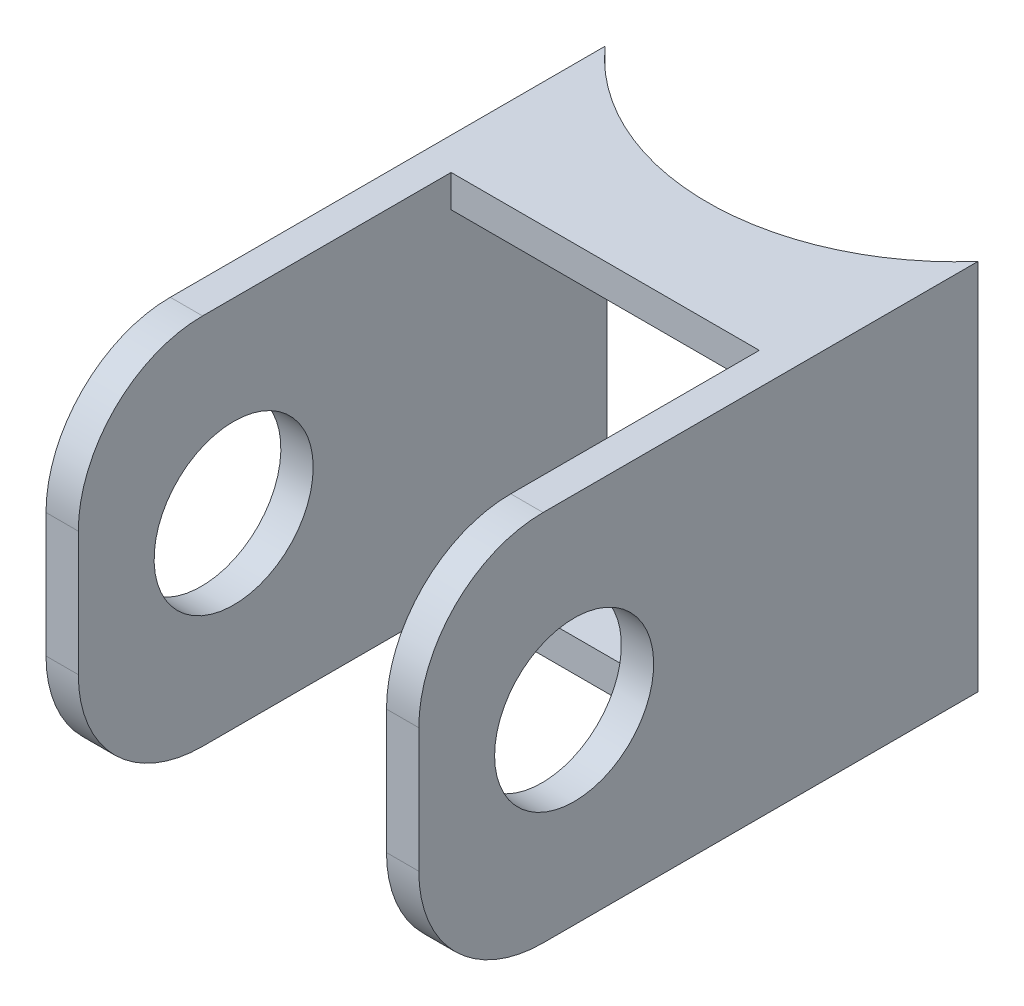
ISO-10303-21;
HEADER;
FILE_DESCRIPTION(('STEP AP214'),'2;1');
FILE_NAME('part.step','',(''),(''),'','','');
FILE_SCHEMA(('AUTOMOTIVE_DESIGN { 1 0 10303 214 1 1 1 1 }'));
ENDSEC;
DATA;
#1=APPLICATION_CONTEXT('core data for automotive mechanical design processes');
#2=APPLICATION_PROTOCOL_DEFINITION('international standard','automotive_design',2000,#1);
#3=PRODUCT_CONTEXT('',#1,'mechanical');
#4=PRODUCT('Part','Part','',(#3));
#5=PRODUCT_RELATED_PRODUCT_CATEGORY('part','',(#4));
#6=PRODUCT_DEFINITION_FORMATION('','',#4);
#7=PRODUCT_DEFINITION_CONTEXT('part definition',#1,'design');
#8=PRODUCT_DEFINITION('design','',#6,#7);
#9=PRODUCT_DEFINITION_SHAPE('','',#8);
#10=(LENGTH_UNIT() NAMED_UNIT(*) SI_UNIT(.MILLI.,.METRE.));
#11=(NAMED_UNIT(*) PLANE_ANGLE_UNIT() SI_UNIT($,.RADIAN.));
#12=(NAMED_UNIT(*) SI_UNIT($,.STERADIAN.) SOLID_ANGLE_UNIT());
#13=UNCERTAINTY_MEASURE_WITH_UNIT(LENGTH_MEASURE(1.E-05),#10,'distance_accuracy_value','');
#14=(GEOMETRIC_REPRESENTATION_CONTEXT(3) GLOBAL_UNCERTAINTY_ASSIGNED_CONTEXT((#13)) GLOBAL_UNIT_ASSIGNED_CONTEXT((#10,
#11,#12)) REPRESENTATION_CONTEXT('',''));
#15=CARTESIAN_POINT('',(0.,0.,0.));
#16=DIRECTION('',(0.,0.,1.));
#17=DIRECTION('',(1.,0.,0.));
#18=AXIS2_PLACEMENT_3D('',#15,#16,#17);
#19=CARTESIAN_POINT('',(0.,0.,28.575));
#20=DIRECTION('',(0.,0.,1.));
#21=DIRECTION('',(1.,0.,0.));
#22=AXIS2_PLACEMENT_3D('',#19,#20,#21);
#23=PLANE('',#22);
#24=DIRECTION('',(0.,-1.,0.));
#25=VECTOR('',#24,1.);
#26=CARTESIAN_POINT('',(-7.874,7.874,28.575));
#27=LINE('',#26,#25);
#28=CARTESIAN_POINT('',(-7.874,3.175,28.575));
#29=VERTEX_POINT('',#28);
#30=CARTESIAN_POINT('',(-7.874,-3.175,28.575));
#31=VERTEX_POINT('',#30);
#32=EDGE_CURVE('E221',#29,#31,#27,.T.);
#33=ORIENTED_EDGE('',*,*,#32,.F.);
#34=DIRECTION('',(-1.,0.,0.));
#35=VECTOR('',#34,1.);
#36=CARTESIAN_POINT('',(-9.525,3.175,28.575));
#37=LINE('',#36,#35);
#38=CARTESIAN_POINT('',(-9.525,3.175,28.575));
#39=VERTEX_POINT('',#38);
#40=EDGE_CURVE('E261',#29,#39,#37,.T.);
#41=ORIENTED_EDGE('',*,*,#40,.T.);
#42=DIRECTION('',(0.,-1.,0.));
#43=VECTOR('',#42,1.);
#44=CARTESIAN_POINT('',(-9.525,9.525,28.575));
#45=LINE('',#44,#43);
#46=CARTESIAN_POINT('',(-9.525,-3.175,28.575));
#47=VERTEX_POINT('',#46);
#48=EDGE_CURVE('E235',#39,#47,#45,.T.);
#49=ORIENTED_EDGE('',*,*,#48,.T.);
#50=DIRECTION('',(1.,0.,0.));
#51=VECTOR('',#50,1.);
#52=CARTESIAN_POINT('',(-7.874,-3.175,28.575));
#53=LINE('',#52,#51);
#54=EDGE_CURVE('E258',#47,#31,#53,.T.);
#55=ORIENTED_EDGE('',*,*,#54,.T.);
#56=EDGE_LOOP('',(#33,#41,#49,#55));
#57=FACE_BOUND('',#56,.T.);
#58=ADVANCED_FACE('F40',(#57),#23,.T.);
#59=DIRECTION('',(0.,1.,0.));
#60=VECTOR('',#59,1.);
#61=CARTESIAN_POINT('',(9.525,9.525,28.575));
#62=LINE('',#61,#60);
#63=CARTESIAN_POINT('',(9.525,-3.175,28.575));
#64=VERTEX_POINT('',#63);
#65=CARTESIAN_POINT('',(9.525,3.175,28.575));
#66=VERTEX_POINT('',#65);
#67=EDGE_CURVE('E232',#64,#66,#62,.T.);
#68=ORIENTED_EDGE('',*,*,#67,.T.);
#69=DIRECTION('',(-1.,0.,0.));
#70=VECTOR('',#69,1.);
#71=CARTESIAN_POINT('',(7.874,3.175,28.575));
#72=LINE('',#71,#70);
#73=CARTESIAN_POINT('',(7.874,3.175,28.575));
#74=VERTEX_POINT('',#73);
#75=EDGE_CURVE('E278',#66,#74,#72,.T.);
#76=ORIENTED_EDGE('',*,*,#75,.T.);
#77=DIRECTION('',(0.,1.,0.));
#78=VECTOR('',#77,1.);
#79=CARTESIAN_POINT('',(7.874,7.874,28.575));
#80=LINE('',#79,#78);
#81=CARTESIAN_POINT('',(7.874,-3.175,28.575));
#82=VERTEX_POINT('',#81);
#83=EDGE_CURVE('E218',#82,#74,#80,.T.);
#84=ORIENTED_EDGE('',*,*,#83,.F.);
#85=DIRECTION('',(1.,0.,0.));
#86=VECTOR('',#85,1.);
#87=CARTESIAN_POINT('',(9.525,-3.175,28.575));
#88=LINE('',#87,#86);
#89=EDGE_CURVE('E275',#82,#64,#88,.T.);
#90=ORIENTED_EDGE('',*,*,#89,.T.);
#91=EDGE_LOOP('',(#68,#76,#84,#90));
#92=FACE_BOUND('',#91,.T.);
#93=ADVANCED_FACE('F294',(#92),#23,.T.);
#94=CARTESIAN_POINT('',(9.525,9.525,28.575));
#95=DIRECTION('',(-1.,0.,0.));
#96=DIRECTION('',(0.,-1.,0.));
#97=AXIS2_PLACEMENT_3D('',#94,#95,#96);
#98=PLANE('',#97);
#99=CARTESIAN_POINT('',(9.525,0.,20.6375));
#100=DIRECTION('',(-1.,0.,0.));
#101=DIRECTION('',(0.,-1.,0.));
#102=AXIS2_PLACEMENT_3D('',#99,#100,#101);
#103=CIRCLE('',#102,4.064);
#104=CARTESIAN_POINT('',(9.525,-4.064,20.6375));
#105=VERTEX_POINT('',#104);
#106=EDGE_CURVE('E200',#105,#105,#103,.T.);
#107=ORIENTED_EDGE('',*,*,#106,.T.);
#108=EDGE_LOOP('',(#107));
#109=FACE_BOUND('',#108,.T.);
#110=DIRECTION('',(0.,0.,-1.));
#111=VECTOR('',#110,1.);
#112=CARTESIAN_POINT('',(9.525,9.525,28.575));
#113=LINE('',#112,#111);
#114=CARTESIAN_POINT('',(9.525,9.525,22.225));
#115=VERTEX_POINT('',#114);
#116=CARTESIAN_POINT('',(9.525,9.525,0.));
#117=VERTEX_POINT('',#116);
#118=EDGE_CURVE('E249',#115,#117,#113,.T.);
#119=ORIENTED_EDGE('',*,*,#118,.F.);
#120=CARTESIAN_POINT('',(9.525,3.175,22.225));
#121=DIRECTION('',(-1.,0.,0.));
#122=DIRECTION('',(0.,-1.,0.));
#123=AXIS2_PLACEMENT_3D('',#120,#121,#122);
#124=CIRCLE('',#123,6.35);
#125=EDGE_CURVE('E286',#115,#66,#124,.F.);
#126=ORIENTED_EDGE('',*,*,#125,.T.);
#127=ORIENTED_EDGE('',*,*,#67,.F.);
#128=CARTESIAN_POINT('',(9.525,-3.175,22.225));
#129=DIRECTION('',(-1.,0.,0.));
#130=DIRECTION('',(0.,-1.,0.));
#131=AXIS2_PLACEMENT_3D('',#128,#129,#130);
#132=CIRCLE('',#131,6.35);
#133=CARTESIAN_POINT('',(9.525,-9.525,22.225));
#134=VERTEX_POINT('',#133);
#135=EDGE_CURVE('E55',#64,#134,#132,.F.);
#136=ORIENTED_EDGE('',*,*,#135,.T.);
#137=DIRECTION('',(0.,0.,-1.));
#138=VECTOR('',#137,1.);
#139=CARTESIAN_POINT('',(9.525,-9.525,28.575));
#140=LINE('',#139,#138);
#141=CARTESIAN_POINT('',(9.525,-9.525,0.));
#142=VERTEX_POINT('',#141);
#143=EDGE_CURVE('E239',#134,#142,#140,.T.);
#144=ORIENTED_EDGE('',*,*,#143,.T.);
#145=DIRECTION('',(0.,1.,0.));
#146=VECTOR('',#145,1.);
#147=CARTESIAN_POINT('',(9.525,9.525,0.));
#148=LINE('',#147,#146);
#149=EDGE_CURVE('E231',#142,#117,#148,.T.);
#150=ORIENTED_EDGE('',*,*,#149,.T.);
#151=EDGE_LOOP('',(#119,#126,#127,#136,#144,#150));
#152=FACE_BOUND('',#151,.T.);
#153=ADVANCED_FACE('F289',(#109,#152),#98,.F.);
#154=CARTESIAN_POINT('',(-9.525,9.525,28.575));
#155=DIRECTION('',(0.,-1.,0.));
#156=DIRECTION('',(0.,0.,-1.));
#157=AXIS2_PLACEMENT_3D('',#154,#155,#156);
#158=PLANE('',#157);
#159=DIRECTION('',(0.,0.,-1.));
#160=VECTOR('',#159,1.);
#161=CARTESIAN_POINT('',(-9.525,9.525,28.575));
#162=LINE('',#161,#160);
#163=CARTESIAN_POINT('',(-9.525,9.525,22.225));
#164=VERTEX_POINT('',#163);
#165=CARTESIAN_POINT('',(-9.525,9.525,0.));
#166=VERTEX_POINT('',#165);
#167=EDGE_CURVE('E247',#164,#166,#162,.T.);
#168=ORIENTED_EDGE('',*,*,#167,.F.);
#169=DIRECTION('',(-1.,0.,0.));
#170=VECTOR('',#169,1.);
#171=CARTESIAN_POINT('',(-7.874,9.525,22.225));
#172=LINE('',#171,#170);
#173=CARTESIAN_POINT('',(-7.874,9.525,22.225));
#174=VERTEX_POINT('',#173);
#175=EDGE_CURVE('E159',#164,#174,#172,.F.);
#176=ORIENTED_EDGE('',*,*,#175,.T.);
#177=DIRECTION('',(0.,0.,-1.));
#178=VECTOR('',#177,1.);
#179=CARTESIAN_POINT('',(-7.874,9.525,28.575));
#180=LINE('',#179,#178);
#181=CARTESIAN_POINT('',(-7.874,9.525,9.52500000000001));
#182=VERTEX_POINT('',#181);
#183=EDGE_CURVE('E151',#174,#182,#180,.T.);
#184=ORIENTED_EDGE('',*,*,#183,.T.);
#185=DIRECTION('',(1.,0.,0.));
#186=VECTOR('',#185,1.);
#187=CARTESIAN_POINT('',(-7.874,9.525,9.52500000000001));
#188=LINE('',#187,#186);
#189=CARTESIAN_POINT('',(7.874,9.525,9.52500000000001));
#190=VERTEX_POINT('',#189);
#191=EDGE_CURVE('E157',#182,#190,#188,.T.);
#192=ORIENTED_EDGE('',*,*,#191,.T.);
#193=DIRECTION('',(0.,0.,1.));
#194=VECTOR('',#193,1.);
#195=CARTESIAN_POINT('',(7.874,9.525,28.575));
#196=LINE('',#195,#194);
#197=CARTESIAN_POINT('',(7.874,9.525,22.225));
#198=VERTEX_POINT('',#197);
#199=EDGE_CURVE('E178',#190,#198,#196,.T.);
#200=ORIENTED_EDGE('',*,*,#199,.T.);
#201=DIRECTION('',(-1.,0.,0.));
#202=VECTOR('',#201,1.);
#203=CARTESIAN_POINT('',(9.525,9.525,22.225));
#204=LINE('',#203,#202);
#205=EDGE_CURVE('E268',#198,#115,#204,.F.);
#206=ORIENTED_EDGE('',*,*,#205,.T.);
#207=ORIENTED_EDGE('',*,*,#118,.T.);
#208=CARTESIAN_POINT('',(0.,9.525,-8.40026041263007));
#209=DIRECTION('',(0.,-1.,0.));
#210=DIRECTION('',(0.,0.,-1.));
#211=AXIS2_PLACEMENT_3D('',#208,#209,#210);
#212=CIRCLE('',#211,12.7);
#213=EDGE_CURVE('E215',#117,#166,#212,.T.);
#214=ORIENTED_EDGE('',*,*,#213,.T.);
#215=EDGE_LOOP('',(#168,#176,#184,#192,#200,#206,#207,#214));
#216=FACE_BOUND('',#215,.T.);
#217=ADVANCED_FACE('F154',(#216),#158,.F.);
#218=CARTESIAN_POINT('',(-9.525,9.525,28.575));
#219=DIRECTION('',(1.,0.,0.));
#220=DIRECTION('',(0.,1.,0.));
#221=AXIS2_PLACEMENT_3D('',#218,#219,#220);
#222=PLANE('',#221);
#223=CARTESIAN_POINT('',(-9.52500000000001,0.,20.6375));
#224=DIRECTION('',(1.,0.,0.));
#225=DIRECTION('',(0.,1.,0.));
#226=AXIS2_PLACEMENT_3D('',#223,#224,#225);
#227=CIRCLE('',#226,4.064);
#228=CARTESIAN_POINT('',(-9.52500000000001,4.064,20.6375));
#229=VERTEX_POINT('',#228);
#230=EDGE_CURVE('E193',#229,#229,#227,.T.);
#231=ORIENTED_EDGE('',*,*,#230,.T.);
#232=EDGE_LOOP('',(#231));
#233=FACE_BOUND('',#232,.T.);
#234=ORIENTED_EDGE('',*,*,#48,.F.);
#235=CARTESIAN_POINT('',(-9.525,3.175,22.225));
#236=DIRECTION('',(1.,0.,0.));
#237=DIRECTION('',(0.,1.,0.));
#238=AXIS2_PLACEMENT_3D('',#235,#236,#237);
#239=CIRCLE('',#238,6.35);
#240=EDGE_CURVE('E266',#39,#164,#239,.F.);
#241=ORIENTED_EDGE('',*,*,#240,.T.);
#242=ORIENTED_EDGE('',*,*,#167,.T.);
#243=DIRECTION('',(0.,-1.,0.));
#244=VECTOR('',#243,1.);
#245=CARTESIAN_POINT('',(-9.525,9.525,0.));
#246=LINE('',#245,#244);
#247=CARTESIAN_POINT('',(-9.525,-9.525,0.));
#248=VERTEX_POINT('',#247);
#249=EDGE_CURVE('E236',#166,#248,#246,.T.);
#250=ORIENTED_EDGE('',*,*,#249,.T.);
#251=DIRECTION('',(0.,0.,-1.));
#252=VECTOR('',#251,1.);
#253=CARTESIAN_POINT('',(-9.525,-9.525,28.575));
#254=LINE('',#253,#252);
#255=CARTESIAN_POINT('',(-9.525,-9.525,22.225));
#256=VERTEX_POINT('',#255);
#257=EDGE_CURVE('E245',#256,#248,#254,.T.);
#258=ORIENTED_EDGE('',*,*,#257,.F.);
#259=CARTESIAN_POINT('',(-9.525,-3.175,22.225));
#260=DIRECTION('',(1.,0.,0.));
#261=DIRECTION('',(0.,1.,0.));
#262=AXIS2_PLACEMENT_3D('',#259,#260,#261);
#263=CIRCLE('',#262,6.35);
#264=EDGE_CURVE('E264',#256,#47,#263,.F.);
#265=ORIENTED_EDGE('',*,*,#264,.T.);
#266=EDGE_LOOP('',(#234,#241,#242,#250,#258,#265));
#267=FACE_BOUND('',#266,.T.);
#268=ADVANCED_FACE('F349',(#233,#267),#222,.F.);
#269=CARTESIAN_POINT('',(-9.525,-9.525,28.575));
#270=DIRECTION('',(0.,1.,0.));
#271=DIRECTION('',(0.,0.,1.));
#272=AXIS2_PLACEMENT_3D('',#269,#270,#271);
#273=PLANE('',#272);
#274=DIRECTION('',(0.,0.,1.));
#275=VECTOR('',#274,1.);
#276=CARTESIAN_POINT('',(-7.874,-9.525,28.575));
#277=LINE('',#276,#275);
#278=CARTESIAN_POINT('',(-7.874,-9.525,9.52500000000001));
#279=VERTEX_POINT('',#278);
#280=CARTESIAN_POINT('',(-7.874,-9.525,22.225));
#281=VERTEX_POINT('',#280);
#282=EDGE_CURVE('E185',#279,#281,#277,.T.);
#283=ORIENTED_EDGE('',*,*,#282,.T.);
#284=DIRECTION('',(1.,0.,0.));
#285=VECTOR('',#284,1.);
#286=CARTESIAN_POINT('',(-9.525,-9.525,22.225));
#287=LINE('',#286,#285);
#288=EDGE_CURVE('E11',#281,#256,#287,.F.);
#289=ORIENTED_EDGE('',*,*,#288,.T.);
#290=ORIENTED_EDGE('',*,*,#257,.T.);
#291=CARTESIAN_POINT('',(0.,-9.525,-8.40026041263007));
#292=DIRECTION('',(0.,1.,0.));
#293=DIRECTION('',(0.,0.,1.));
#294=AXIS2_PLACEMENT_3D('',#291,#292,#293);
#295=CIRCLE('',#294,12.7);
#296=EDGE_CURVE('E203',#248,#142,#295,.T.);
#297=ORIENTED_EDGE('',*,*,#296,.T.);
#298=ORIENTED_EDGE('',*,*,#143,.F.);
#299=DIRECTION('',(1.,0.,0.));
#300=VECTOR('',#299,1.);
#301=CARTESIAN_POINT('',(7.874,-9.525,22.225));
#302=LINE('',#301,#300);
#303=CARTESIAN_POINT('',(7.874,-9.525,22.225));
#304=VERTEX_POINT('',#303);
#305=EDGE_CURVE('E48',#134,#304,#302,.F.);
#306=ORIENTED_EDGE('',*,*,#305,.T.);
#307=DIRECTION('',(0.,0.,-1.));
#308=VECTOR('',#307,1.);
#309=CARTESIAN_POINT('',(7.874,-9.525,28.575));
#310=LINE('',#309,#308);
#311=CARTESIAN_POINT('',(7.874,-9.525,9.52500000000001));
#312=VERTEX_POINT('',#311);
#313=EDGE_CURVE('E182',#304,#312,#310,.T.);
#314=ORIENTED_EDGE('',*,*,#313,.T.);
#315=DIRECTION('',(-1.,0.,0.));
#316=VECTOR('',#315,1.);
#317=CARTESIAN_POINT('',(-9.525,-9.525,9.52500000000001));
#318=LINE('',#317,#316);
#319=EDGE_CURVE('E190',#312,#279,#318,.T.);
#320=ORIENTED_EDGE('',*,*,#319,.T.);
#321=EDGE_LOOP('',(#283,#289,#290,#297,#298,#306,#314,#320));
#322=FACE_BOUND('',#321,.T.);
#323=ADVANCED_FACE('F307',(#322),#273,.F.);
#324=CARTESIAN_POINT('',(7.874,7.874,28.575));
#325=DIRECTION('',(-1.,0.,0.));
#326=DIRECTION('',(0.,0.,1.));
#327=AXIS2_PLACEMENT_3D('',#324,#325,#326);
#328=PLANE('',#327);
#329=ORIENTED_EDGE('',*,*,#83,.T.);
#330=CARTESIAN_POINT('',(7.874,3.175,22.225));
#331=DIRECTION('',(-1.,0.,0.));
#332=DIRECTION('',(0.,0.,1.));
#333=AXIS2_PLACEMENT_3D('',#330,#331,#332);
#334=CIRCLE('',#333,6.35);
#335=EDGE_CURVE('E283',#74,#198,#334,.T.);
#336=ORIENTED_EDGE('',*,*,#335,.T.);
#337=ORIENTED_EDGE('',*,*,#199,.F.);
#338=DIRECTION('',(0.,-1.,0.));
#339=VECTOR('',#338,1.);
#340=CARTESIAN_POINT('',(7.874,9.525,9.52500000000001));
#341=LINE('',#340,#339);
#342=CARTESIAN_POINT('',(7.874,7.874,9.52500000000001));
#343=VERTEX_POINT('',#342);
#344=EDGE_CURVE('E176',#190,#343,#341,.T.);
#345=ORIENTED_EDGE('',*,*,#344,.T.);
#346=DIRECTION('',(0.,0.,-1.));
#347=VECTOR('',#346,1.);
#348=CARTESIAN_POINT('',(7.874,7.874,28.575));
#349=LINE('',#348,#347);
#350=CARTESIAN_POINT('',(7.874,7.874,1.5641825723039));
#351=VERTEX_POINT('',#350);
#352=EDGE_CURVE('E229',#343,#351,#349,.T.);
#353=ORIENTED_EDGE('',*,*,#352,.T.);
#354=DIRECTION('',(0.,1.,0.));
#355=VECTOR('',#354,1.);
#356=CARTESIAN_POINT('',(7.874,-9.525,1.5641825723039));
#357=LINE('',#356,#355);
#358=CARTESIAN_POINT('',(7.874,-7.874,1.5641825723039));
#359=VERTEX_POINT('',#358);
#360=EDGE_CURVE('E212',#359,#351,#357,.T.);
#361=ORIENTED_EDGE('',*,*,#360,.F.);
#362=DIRECTION('',(0.,0.,-1.));
#363=VECTOR('',#362,1.);
#364=CARTESIAN_POINT('',(7.874,-7.874,28.575));
#365=LINE('',#364,#363);
#366=CARTESIAN_POINT('',(7.874,-7.874,9.52500000000001));
#367=VERTEX_POINT('',#366);
#368=EDGE_CURVE('E224',#367,#359,#365,.T.);
#369=ORIENTED_EDGE('',*,*,#368,.F.);
#370=EDGE_CURVE('E171',#367,#312,#341,.T.);
#371=ORIENTED_EDGE('',*,*,#370,.T.);
#372=ORIENTED_EDGE('',*,*,#313,.F.);
#373=CARTESIAN_POINT('',(7.874,-3.175,22.225));
#374=DIRECTION('',(-1.,0.,0.));
#375=DIRECTION('',(0.,0.,1.));
#376=AXIS2_PLACEMENT_3D('',#373,#374,#375);
#377=CIRCLE('',#376,6.35);
#378=EDGE_CURVE('E281',#304,#82,#377,.T.);
#379=ORIENTED_EDGE('',*,*,#378,.T.);
#380=EDGE_LOOP('',(#329,#336,#337,#345,#353,#361,#369,#371,#372,#379));
#381=FACE_BOUND('',#380,.T.);
#382=CARTESIAN_POINT('',(7.874,0.,20.6375));
#383=DIRECTION('',(-1.,0.,0.));
#384=DIRECTION('',(0.,0.,1.));
#385=AXIS2_PLACEMENT_3D('',#382,#383,#384);
#386=CIRCLE('',#385,4.064);
#387=CARTESIAN_POINT('',(7.874,0.,24.7015));
#388=VERTEX_POINT('',#387);
#389=EDGE_CURVE('E197',#388,#388,#386,.T.);
#390=ORIENTED_EDGE('',*,*,#389,.F.);
#391=EDGE_LOOP('',(#390));
#392=FACE_BOUND('',#391,.T.);
#393=ADVANCED_FACE('F299',(#381,#392),#328,.T.);
#394=CARTESIAN_POINT('',(-7.874,7.874,28.575));
#395=DIRECTION('',(0.,-1.,0.));
#396=DIRECTION('',(0.,0.,-1.));
#397=AXIS2_PLACEMENT_3D('',#394,#395,#396);
#398=PLANE('',#397);
#399=DIRECTION('',(1.,0.,0.));
#400=VECTOR('',#399,1.);
#401=CARTESIAN_POINT('',(-7.874,7.874,9.52500000000001));
#402=LINE('',#401,#400);
#403=CARTESIAN_POINT('',(-7.874,7.874,9.52500000000001));
#404=VERTEX_POINT('',#403);
#405=EDGE_CURVE('E188',#404,#343,#402,.T.);
#406=ORIENTED_EDGE('',*,*,#405,.F.);
#407=DIRECTION('',(0.,0.,-1.));
#408=VECTOR('',#407,1.);
#409=CARTESIAN_POINT('',(-7.874,7.874,28.575));
#410=LINE('',#409,#408);
#411=CARTESIAN_POINT('',(-7.874,7.874,1.5641825723039));
#412=VERTEX_POINT('',#411);
#413=EDGE_CURVE('E168',#404,#412,#410,.T.);
#414=ORIENTED_EDGE('',*,*,#413,.T.);
#415=CARTESIAN_POINT('',(0.,7.874,-8.40026041263007));
#416=DIRECTION('',(0.,-1.,0.));
#417=DIRECTION('',(0.,0.,-1.));
#418=AXIS2_PLACEMENT_3D('',#415,#416,#417);
#419=CIRCLE('',#418,12.7);
#420=EDGE_CURVE('E209',#351,#412,#419,.T.);
#421=ORIENTED_EDGE('',*,*,#420,.F.);
#422=ORIENTED_EDGE('',*,*,#352,.F.);
#423=EDGE_LOOP('',(#406,#414,#421,#422));
#424=FACE_BOUND('',#423,.T.);
#425=ADVANCED_FACE('F327',(#424),#398,.T.);
#426=CARTESIAN_POINT('',(-7.874,7.874,28.575));
#427=DIRECTION('',(1.,0.,0.));
#428=DIRECTION('',(0.,0.,-1.));
#429=AXIS2_PLACEMENT_3D('',#426,#427,#428);
#430=PLANE('',#429);
#431=ORIENTED_EDGE('',*,*,#183,.F.);
#432=CARTESIAN_POINT('',(-7.874,3.175,22.225));
#433=DIRECTION('',(1.,0.,0.));
#434=DIRECTION('',(0.,0.,-1.));
#435=AXIS2_PLACEMENT_3D('',#432,#433,#434);
#436=CIRCLE('',#435,6.35);
#437=EDGE_CURVE('E273',#174,#29,#436,.T.);
#438=ORIENTED_EDGE('',*,*,#437,.T.);
#439=ORIENTED_EDGE('',*,*,#32,.T.);
#440=CARTESIAN_POINT('',(-7.874,-3.175,22.225));
#441=DIRECTION('',(1.,0.,0.));
#442=DIRECTION('',(0.,0.,-1.));
#443=AXIS2_PLACEMENT_3D('',#440,#441,#442);
#444=CIRCLE('',#443,6.35);
#445=EDGE_CURVE('E271',#31,#281,#444,.T.);
#446=ORIENTED_EDGE('',*,*,#445,.T.);
#447=ORIENTED_EDGE('',*,*,#282,.F.);
#448=DIRECTION('',(0.,-1.,0.));
#449=VECTOR('',#448,1.);
#450=CARTESIAN_POINT('',(-7.874,9.525,9.52500000000001));
#451=LINE('',#450,#449);
#452=CARTESIAN_POINT('',(-7.874,-7.874,9.52500000000001));
#453=VERTEX_POINT('',#452);
#454=EDGE_CURVE('E172',#453,#279,#451,.T.);
#455=ORIENTED_EDGE('',*,*,#454,.F.);
#456=DIRECTION('',(0.,0.,-1.));
#457=VECTOR('',#456,1.);
#458=CARTESIAN_POINT('',(-7.874,-7.874,28.575));
#459=LINE('',#458,#457);
#460=CARTESIAN_POINT('',(-7.874,-7.874,1.5641825723039));
#461=VERTEX_POINT('',#460);
#462=EDGE_CURVE('E226',#453,#461,#459,.T.);
#463=ORIENTED_EDGE('',*,*,#462,.T.);
#464=DIRECTION('',(0.,1.,0.));
#465=VECTOR('',#464,1.);
#466=CARTESIAN_POINT('',(-7.874,-9.525,1.5641825723039));
#467=LINE('',#466,#465);
#468=EDGE_CURVE('E206',#412,#461,#467,.F.);
#469=ORIENTED_EDGE('',*,*,#468,.F.);
#470=ORIENTED_EDGE('',*,*,#413,.F.);
#471=EDGE_CURVE('E164',#182,#404,#451,.T.);
#472=ORIENTED_EDGE('',*,*,#471,.F.);
#473=EDGE_LOOP('',(#431,#438,#439,#446,#447,#455,#463,#469,#470,#472));
#474=FACE_BOUND('',#473,.T.);
#475=CARTESIAN_POINT('',(-7.874,0.,20.6375));
#476=DIRECTION('',(1.,0.,0.));
#477=DIRECTION('',(0.,0.,-1.));
#478=AXIS2_PLACEMENT_3D('',#475,#476,#477);
#479=CIRCLE('',#478,4.064);
#480=CARTESIAN_POINT('',(-7.874,0.,16.5735));
#481=VERTEX_POINT('',#480);
#482=EDGE_CURVE('E196',#481,#481,#479,.T.);
#483=ORIENTED_EDGE('',*,*,#482,.F.);
#484=EDGE_LOOP('',(#483));
#485=FACE_BOUND('',#484,.T.);
#486=ADVANCED_FACE('F165',(#474,#485),#430,.T.);
#487=CARTESIAN_POINT('',(-7.874,-7.874,28.575));
#488=DIRECTION('',(0.,1.,0.));
#489=DIRECTION('',(0.,0.,1.));
#490=AXIS2_PLACEMENT_3D('',#487,#488,#489);
#491=PLANE('',#490);
#492=DIRECTION('',(-1.,0.,0.));
#493=VECTOR('',#492,1.);
#494=CARTESIAN_POINT('',(-7.874,-7.874,9.52500000000001));
#495=LINE('',#494,#493);
#496=EDGE_CURVE('E254',#367,#453,#495,.T.);
#497=ORIENTED_EDGE('',*,*,#496,.F.);
#498=ORIENTED_EDGE('',*,*,#368,.T.);
#499=CARTESIAN_POINT('',(0.,-7.874,-8.40026041263007));
#500=DIRECTION('',(0.,1.,0.));
#501=DIRECTION('',(0.,0.,1.));
#502=AXIS2_PLACEMENT_3D('',#499,#500,#501);
#503=CIRCLE('',#502,12.7);
#504=EDGE_CURVE('E251',#461,#359,#503,.T.);
#505=ORIENTED_EDGE('',*,*,#504,.F.);
#506=ORIENTED_EDGE('',*,*,#462,.F.);
#507=EDGE_LOOP('',(#497,#498,#505,#506));
#508=FACE_BOUND('',#507,.T.);
#509=ADVANCED_FACE('F321',(#508),#491,.T.);
#510=CARTESIAN_POINT('',(0.,-9.525,-8.40026041263007));
#511=DIRECTION('',(0.,1.,0.));
#512=DIRECTION('',(0.,0.,1.));
#513=AXIS2_PLACEMENT_3D('',#510,#511,#512);
#514=CYLINDRICAL_SURFACE('',#513,12.7);
#515=ORIENTED_EDGE('',*,*,#360,.T.);
#516=ORIENTED_EDGE('',*,*,#420,.T.);
#517=ORIENTED_EDGE('',*,*,#468,.T.);
#518=ORIENTED_EDGE('',*,*,#504,.T.);
#519=EDGE_LOOP('',(#515,#516,#517,#518));
#520=FACE_BOUND('',#519,.T.);
#521=ORIENTED_EDGE('',*,*,#296,.F.);
#522=ORIENTED_EDGE('',*,*,#249,.F.);
#523=ORIENTED_EDGE('',*,*,#213,.F.);
#524=ORIENTED_EDGE('',*,*,#149,.F.);
#525=EDGE_LOOP('',(#521,#522,#523,#524));
#526=FACE_BOUND('',#525,.T.);
#527=ADVANCED_FACE('F306',(#520,#526),#514,.F.);
#528=CARTESIAN_POINT('',(-9.52500000000001,0.,20.6375));
#529=DIRECTION('',(1.,0.,0.));
#530=DIRECTION('',(0.,1.,0.));
#531=AXIS2_PLACEMENT_3D('',#528,#529,#530);
#532=CYLINDRICAL_SURFACE('',#531,4.064);
#533=ORIENTED_EDGE('',*,*,#482,.T.);
#534=EDGE_LOOP('',(#533));
#535=FACE_BOUND('',#534,.T.);
#536=ORIENTED_EDGE('',*,*,#230,.F.);
#537=EDGE_LOOP('',(#536));
#538=FACE_BOUND('',#537,.T.);
#539=ADVANCED_FACE('F440',(#535,#538),#532,.F.);
#540=ORIENTED_EDGE('',*,*,#389,.T.);
#541=EDGE_LOOP('',(#540));
#542=FACE_BOUND('',#541,.T.);
#543=ORIENTED_EDGE('',*,*,#106,.F.);
#544=EDGE_LOOP('',(#543));
#545=FACE_BOUND('',#544,.T.);
#546=ADVANCED_FACE('F411',(#542,#545),#532,.F.);
#547=CARTESIAN_POINT('',(-7.874,9.525,9.52500000000001));
#548=DIRECTION('',(0.,0.,-1.));
#549=DIRECTION('',(-1.,0.,0.));
#550=AXIS2_PLACEMENT_3D('',#547,#548,#549);
#551=PLANE('',#550);
#552=ORIENTED_EDGE('',*,*,#370,.F.);
#553=ORIENTED_EDGE('',*,*,#496,.T.);
#554=ORIENTED_EDGE('',*,*,#454,.T.);
#555=ORIENTED_EDGE('',*,*,#319,.F.);
#556=EDGE_LOOP('',(#552,#553,#554,#555));
#557=FACE_BOUND('',#556,.T.);
#558=ADVANCED_FACE('F315',(#557),#551,.F.);
#559=ORIENTED_EDGE('',*,*,#405,.T.);
#560=ORIENTED_EDGE('',*,*,#344,.F.);
#561=ORIENTED_EDGE('',*,*,#191,.F.);
#562=ORIENTED_EDGE('',*,*,#471,.T.);
#563=EDGE_LOOP('',(#559,#560,#561,#562));
#564=FACE_BOUND('',#563,.T.);
#565=ADVANCED_FACE('F174',(#564),#551,.F.);
#566=CARTESIAN_POINT('',(0.,3.175,22.225));
#567=DIRECTION('',(1.,0.,0.));
#568=DIRECTION('',(0.,0.,-1.));
#569=AXIS2_PLACEMENT_3D('',#566,#567,#568);
#570=CYLINDRICAL_SURFACE('',#569,6.35);
#571=ORIENTED_EDGE('',*,*,#437,.F.);
#572=ORIENTED_EDGE('',*,*,#175,.F.);
#573=ORIENTED_EDGE('',*,*,#240,.F.);
#574=ORIENTED_EDGE('',*,*,#40,.F.);
#575=EDGE_LOOP('',(#571,#572,#573,#574));
#576=FACE_BOUND('',#575,.T.);
#577=ADVANCED_FACE('F358',(#576),#570,.T.);
#578=CARTESIAN_POINT('',(0.,3.175,22.225));
#579=DIRECTION('',(1.,0.,0.));
#580=DIRECTION('',(0.,0.,-1.));
#581=AXIS2_PLACEMENT_3D('',#578,#579,#580);
#582=CYLINDRICAL_SURFACE('',#581,6.35);
#583=ORIENTED_EDGE('',*,*,#125,.F.);
#584=ORIENTED_EDGE('',*,*,#205,.F.);
#585=ORIENTED_EDGE('',*,*,#335,.F.);
#586=ORIENTED_EDGE('',*,*,#75,.F.);
#587=EDGE_LOOP('',(#583,#584,#585,#586));
#588=FACE_BOUND('',#587,.T.);
#589=ADVANCED_FACE('F297',(#588),#582,.T.);
#590=CARTESIAN_POINT('',(0.,-3.175,22.225));
#591=DIRECTION('',(-1.,0.,0.));
#592=DIRECTION('',(0.,0.,1.));
#593=AXIS2_PLACEMENT_3D('',#590,#591,#592);
#594=CYLINDRICAL_SURFACE('',#593,6.35);
#595=ORIENTED_EDGE('',*,*,#264,.F.);
#596=ORIENTED_EDGE('',*,*,#288,.F.);
#597=ORIENTED_EDGE('',*,*,#445,.F.);
#598=ORIENTED_EDGE('',*,*,#54,.F.);
#599=EDGE_LOOP('',(#595,#596,#597,#598));
#600=FACE_BOUND('',#599,.T.);
#601=ADVANCED_FACE('F363',(#600),#594,.T.);
#602=CARTESIAN_POINT('',(0.,-3.175,22.225));
#603=DIRECTION('',(-1.,0.,0.));
#604=DIRECTION('',(0.,0.,1.));
#605=AXIS2_PLACEMENT_3D('',#602,#603,#604);
#606=CYLINDRICAL_SURFACE('',#605,6.35);
#607=ORIENTED_EDGE('',*,*,#378,.F.);
#608=ORIENTED_EDGE('',*,*,#305,.F.);
#609=ORIENTED_EDGE('',*,*,#135,.F.);
#610=ORIENTED_EDGE('',*,*,#89,.F.);
#611=EDGE_LOOP('',(#607,#608,#609,#610));
#612=FACE_BOUND('',#611,.T.);
#613=ADVANCED_FACE('F42',(#612),#606,.T.);
#614=CLOSED_SHELL('',(#58,#93,#153,#217,#268,#323,#393,#425,#486,#509,#527,#539,#546,#558,#565,
#577,#589,#601,#613));
#615=MANIFOLD_SOLID_BREP('B2',#614);
#616=ADVANCED_BREP_SHAPE_REPRESENTATION('',(#18,#615),#14);
#617=SHAPE_DEFINITION_REPRESENTATION(#9,#616);
ENDSEC;
END-ISO-10303-21;
